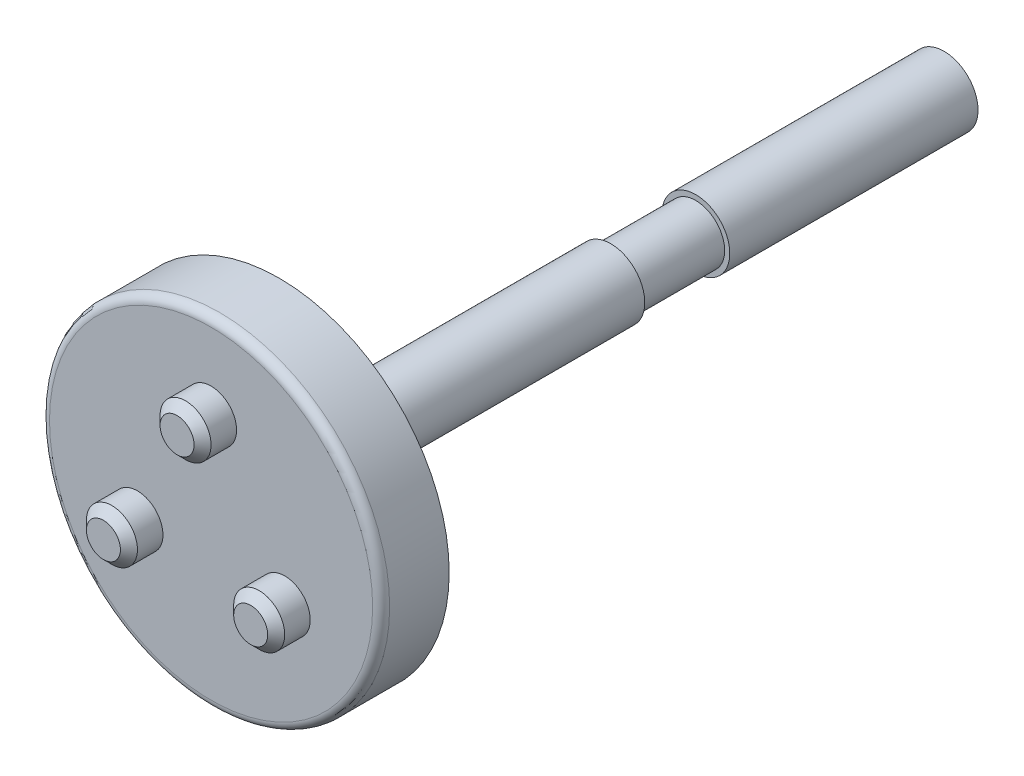
ISO-10303-21;
HEADER;
FILE_DESCRIPTION(('STEP AP214'),'2;1');
FILE_NAME('part.step','',(''),(''),'','','');
FILE_SCHEMA(('AUTOMOTIVE_DESIGN { 1 0 10303 214 1 1 1 1 }'));
ENDSEC;
DATA;
#1=APPLICATION_CONTEXT('core data for automotive mechanical design processes');
#2=APPLICATION_PROTOCOL_DEFINITION('international standard','automotive_design',2000,#1);
#3=PRODUCT_CONTEXT('',#1,'mechanical');
#4=PRODUCT('Part','Part','',(#3));
#5=PRODUCT_RELATED_PRODUCT_CATEGORY('part','',(#4));
#6=PRODUCT_DEFINITION_FORMATION('','',#4);
#7=PRODUCT_DEFINITION_CONTEXT('part definition',#1,'design');
#8=PRODUCT_DEFINITION('design','',#6,#7);
#9=PRODUCT_DEFINITION_SHAPE('','',#8);
#10=(LENGTH_UNIT() NAMED_UNIT(*) SI_UNIT(.MILLI.,.METRE.));
#11=(NAMED_UNIT(*) PLANE_ANGLE_UNIT() SI_UNIT($,.RADIAN.));
#12=(NAMED_UNIT(*) SI_UNIT($,.STERADIAN.) SOLID_ANGLE_UNIT());
#13=UNCERTAINTY_MEASURE_WITH_UNIT(LENGTH_MEASURE(1.E-05),#10,'distance_accuracy_value','');
#14=(GEOMETRIC_REPRESENTATION_CONTEXT(3) GLOBAL_UNCERTAINTY_ASSIGNED_CONTEXT((#13)) GLOBAL_UNIT_ASSIGNED_CONTEXT((#10,
#11,#12)) REPRESENTATION_CONTEXT('',''));
#15=CARTESIAN_POINT('',(0.,0.,0.));
#16=DIRECTION('',(0.,0.,1.));
#17=DIRECTION('',(1.,0.,0.));
#18=AXIS2_PLACEMENT_3D('',#15,#16,#17);
#19=CARTESIAN_POINT('',(0.,0.,-495.));
#20=DIRECTION('',(0.,0.,1.));
#21=DIRECTION('',(1.,0.,0.));
#22=AXIS2_PLACEMENT_3D('',#19,#20,#21);
#23=CYLINDRICAL_SURFACE('',#22,20.);
#24=CARTESIAN_POINT('',(0.,0.,-245.));
#25=DIRECTION('',(0.,0.,-1.));
#26=DIRECTION('',(-1.,0.,0.));
#27=AXIS2_PLACEMENT_3D('',#24,#25,#26);
#28=CIRCLE('',#27,20.);
#29=CARTESIAN_POINT('',(-20.,0.,-245.));
#30=VERTEX_POINT('',#29);
#31=EDGE_CURVE('E72',#30,#30,#28,.T.);
#32=ORIENTED_EDGE('',*,*,#31,.T.);
#33=EDGE_LOOP('',(#32));
#34=FACE_BOUND('',#33,.T.);
#35=CARTESIAN_POINT('',(0.,0.,-390.98));
#36=DIRECTION('',(0.,0.,-1.));
#37=DIRECTION('',(-1.,0.,0.));
#38=AXIS2_PLACEMENT_3D('',#35,#36,#37);
#39=CIRCLE('',#38,20.);
#40=CARTESIAN_POINT('',(-20.,0.,-390.98));
#41=VERTEX_POINT('',#40);
#42=EDGE_CURVE('E92',#41,#41,#39,.T.);
#43=ORIENTED_EDGE('',*,*,#42,.F.);
#44=EDGE_LOOP('',(#43));
#45=FACE_BOUND('',#44,.T.);
#46=ADVANCED_FACE('F35',(#34,#45),#23,.T.);
#47=CARTESIAN_POINT('',(0.,0.,0.));
#48=DIRECTION('',(0.,0.,-1.));
#49=DIRECTION('',(-1.,0.,0.));
#50=AXIS2_PLACEMENT_3D('',#47,#48,#49);
#51=CIRCLE('',#50,20.);
#52=CARTESIAN_POINT('',(-20.,0.,0.));
#53=VERTEX_POINT('',#52);
#54=EDGE_CURVE('E67',#53,#53,#51,.T.);
#55=ORIENTED_EDGE('',*,*,#54,.T.);
#56=EDGE_LOOP('',(#55));
#57=FACE_BOUND('',#56,.T.);
#58=CARTESIAN_POINT('',(0.,0.,-195.));
#59=DIRECTION('',(0.,0.,-1.));
#60=DIRECTION('',(-1.,0.,0.));
#61=AXIS2_PLACEMENT_3D('',#58,#59,#60);
#62=CIRCLE('',#61,20.);
#63=CARTESIAN_POINT('',(-20.,0.,-195.));
#64=VERTEX_POINT('',#63);
#65=EDGE_CURVE('E68',#64,#64,#62,.T.);
#66=ORIENTED_EDGE('',*,*,#65,.F.);
#67=EDGE_LOOP('',(#66));
#68=FACE_BOUND('',#67,.T.);
#69=ADVANCED_FACE('F101',(#57,#68),#23,.T.);
#70=CARTESIAN_POINT('',(0.,0.,40.));
#71=DIRECTION('',(0.,0.,-1.));
#72=DIRECTION('',(-1.,0.,0.));
#73=AXIS2_PLACEMENT_3D('',#70,#71,#72);
#74=CYLINDRICAL_SURFACE('',#73,100.);
#75=CARTESIAN_POINT('',(0.,0.,35.));
#76=DIRECTION('',(0.,0.,1.));
#77=DIRECTION('',(1.,0.,0.));
#78=AXIS2_PLACEMENT_3D('',#75,#76,#77);
#79=CIRCLE('',#78,100.);
#80=CARTESIAN_POINT('',(100.,0.,35.));
#81=VERTEX_POINT('',#80);
#82=EDGE_CURVE('E11',#81,#81,#79,.F.);
#83=ORIENTED_EDGE('',*,*,#82,.T.);
#84=EDGE_LOOP('',(#83));
#85=FACE_BOUND('',#84,.T.);
#86=CARTESIAN_POINT('',(0.,0.,0.));
#87=DIRECTION('',(0.,0.,1.));
#88=DIRECTION('',(1.,0.,0.));
#89=AXIS2_PLACEMENT_3D('',#86,#87,#88);
#90=CIRCLE('',#89,100.);
#91=CARTESIAN_POINT('',(100.,0.,0.));
#92=VERTEX_POINT('',#91);
#93=EDGE_CURVE('E76',#92,#92,#90,.T.);
#94=ORIENTED_EDGE('',*,*,#93,.T.);
#95=EDGE_LOOP('',(#94));
#96=FACE_BOUND('',#95,.T.);
#97=ADVANCED_FACE('F109',(#85,#96),#74,.T.);
#98=CARTESIAN_POINT('',(0.,0.,40.));
#99=DIRECTION('',(0.,0.,1.));
#100=DIRECTION('',(1.,0.,0.));
#101=AXIS2_PLACEMENT_3D('',#98,#99,#100);
#102=PLANE('',#101);
#103=CARTESIAN_POINT('',(0.,0.,40.));
#104=DIRECTION('',(0.,0.,1.));
#105=DIRECTION('',(1.,0.,0.));
#106=AXIS2_PLACEMENT_3D('',#103,#104,#105);
#107=CIRCLE('',#106,95.);
#108=CARTESIAN_POINT('',(95.,0.,40.));
#109=VERTEX_POINT('',#108);
#110=EDGE_CURVE('E42',#109,#109,#107,.T.);
#111=ORIENTED_EDGE('',*,*,#110,.T.);
#112=EDGE_LOOP('',(#111));
#113=FACE_BOUND('',#112,.T.);
#114=CARTESIAN_POINT('',(-43.3012701892219,-25.,40.));
#115=DIRECTION('',(0.,0.,1.));
#116=DIRECTION('',(1.,0.,0.));
#117=AXIS2_PLACEMENT_3D('',#114,#115,#116);
#118=CIRCLE('',#117,15.0000000000005);
#119=CARTESIAN_POINT('',(-28.3012701892215,-25.,40.));
#120=VERTEX_POINT('',#119);
#121=EDGE_CURVE('E71',#120,#120,#118,.T.);
#122=ORIENTED_EDGE('',*,*,#121,.F.);
#123=EDGE_LOOP('',(#122));
#124=FACE_BOUND('',#123,.T.);
#125=CARTESIAN_POINT('',(43.3012701892219,-25.,40.));
#126=DIRECTION('',(0.,0.,1.));
#127=DIRECTION('',(1.,0.,0.));
#128=AXIS2_PLACEMENT_3D('',#125,#126,#127);
#129=CIRCLE('',#128,15.0000000000002);
#130=CARTESIAN_POINT('',(58.3012701892221,-25.,40.));
#131=VERTEX_POINT('',#130);
#132=EDGE_CURVE('E82',#131,#131,#129,.T.);
#133=ORIENTED_EDGE('',*,*,#132,.F.);
#134=EDGE_LOOP('',(#133));
#135=FACE_BOUND('',#134,.T.);
#136=CARTESIAN_POINT('',(0.,50.,40.));
#137=DIRECTION('',(0.,0.,1.));
#138=DIRECTION('',(1.,0.,0.));
#139=AXIS2_PLACEMENT_3D('',#136,#137,#138);
#140=CIRCLE('',#139,15.);
#141=CARTESIAN_POINT('',(15.,50.,40.));
#142=VERTEX_POINT('',#141);
#143=EDGE_CURVE('E79',#142,#142,#140,.T.);
#144=ORIENTED_EDGE('',*,*,#143,.F.);
#145=EDGE_LOOP('',(#144));
#146=FACE_BOUND('',#145,.T.);
#147=ADVANCED_FACE('F141',(#113,#124,#135,#146),#102,.T.);
#148=CARTESIAN_POINT('',(0.,0.,0.));
#149=DIRECTION('',(0.,0.,1.));
#150=DIRECTION('',(1.,0.,0.));
#151=AXIS2_PLACEMENT_3D('',#148,#149,#150);
#152=PLANE('',#151);
#153=ORIENTED_EDGE('',*,*,#54,.F.);
#154=EDGE_LOOP('',(#153));
#155=FACE_BOUND('',#154,.T.);
#156=ORIENTED_EDGE('',*,*,#93,.F.);
#157=EDGE_LOOP('',(#156));
#158=FACE_BOUND('',#157,.T.);
#159=ADVANCED_FACE('F139',(#155,#158),#152,.F.);
#160=CARTESIAN_POINT('',(0.,50.,60.));
#161=DIRECTION('',(0.,0.,-1.));
#162=DIRECTION('',(-1.,0.,0.));
#163=AXIS2_PLACEMENT_3D('',#160,#161,#162);
#164=CYLINDRICAL_SURFACE('',#163,15.);
#165=CARTESIAN_POINT('',(0.,50.,55.));
#166=DIRECTION('',(0.,0.,1.));
#167=DIRECTION('',(1.,0.,0.));
#168=AXIS2_PLACEMENT_3D('',#165,#166,#167);
#169=CIRCLE('',#168,15.);
#170=CARTESIAN_POINT('',(15.,50.,55.));
#171=VERTEX_POINT('',#170);
#172=EDGE_CURVE('E46',#171,#171,#169,.F.);
#173=ORIENTED_EDGE('',*,*,#172,.T.);
#174=EDGE_LOOP('',(#173));
#175=FACE_BOUND('',#174,.T.);
#176=ORIENTED_EDGE('',*,*,#143,.T.);
#177=EDGE_LOOP('',(#176));
#178=FACE_BOUND('',#177,.T.);
#179=ADVANCED_FACE('F135',(#175,#178),#164,.T.);
#180=CARTESIAN_POINT('',(0.,50.,60.));
#181=DIRECTION('',(0.,0.,1.));
#182=DIRECTION('',(1.,0.,0.));
#183=AXIS2_PLACEMENT_3D('',#180,#181,#182);
#184=PLANE('',#183);
#185=CARTESIAN_POINT('',(0.,50.,60.));
#186=DIRECTION('',(0.,0.,1.));
#187=DIRECTION('',(1.,0.,0.));
#188=AXIS2_PLACEMENT_3D('',#185,#186,#187);
#189=CIRCLE('',#188,10.0000000000001);
#190=CARTESIAN_POINT('',(10.0000000000001,50.,60.));
#191=VERTEX_POINT('',#190);
#192=EDGE_CURVE('E50',#191,#191,#189,.T.);
#193=ORIENTED_EDGE('',*,*,#192,.T.);
#194=EDGE_LOOP('',(#193));
#195=FACE_BOUND('',#194,.T.);
#196=ADVANCED_FACE('F131',(#195),#184,.T.);
#197=CARTESIAN_POINT('',(43.3012701892219,-25.,60.));
#198=DIRECTION('',(0.,0.,-1.));
#199=DIRECTION('',(-1.,0.,0.));
#200=AXIS2_PLACEMENT_3D('',#197,#198,#199);
#201=CYLINDRICAL_SURFACE('',#200,15.0000000000002);
#202=CARTESIAN_POINT('',(43.3012701892219,-25.,55.));
#203=DIRECTION('',(0.,0.,1.));
#204=DIRECTION('',(1.,0.,0.));
#205=AXIS2_PLACEMENT_3D('',#202,#203,#204);
#206=CIRCLE('',#205,15.0000000000002);
#207=CARTESIAN_POINT('',(58.3012701892221,-25.,55.));
#208=VERTEX_POINT('',#207);
#209=EDGE_CURVE('E55',#208,#208,#206,.F.);
#210=ORIENTED_EDGE('',*,*,#209,.T.);
#211=EDGE_LOOP('',(#210));
#212=FACE_BOUND('',#211,.T.);
#213=ORIENTED_EDGE('',*,*,#132,.T.);
#214=EDGE_LOOP('',(#213));
#215=FACE_BOUND('',#214,.T.);
#216=ADVANCED_FACE('F127',(#212,#215),#201,.T.);
#217=CARTESIAN_POINT('',(43.3012701892219,-25.,60.));
#218=DIRECTION('',(0.,0.,1.));
#219=DIRECTION('',(1.,0.,0.));
#220=AXIS2_PLACEMENT_3D('',#217,#218,#219);
#221=PLANE('',#220);
#222=CARTESIAN_POINT('',(43.3012701892219,-25.,60.));
#223=DIRECTION('',(0.,0.,1.));
#224=DIRECTION('',(1.,0.,0.));
#225=AXIS2_PLACEMENT_3D('',#222,#223,#224);
#226=CIRCLE('',#225,10.0000000000002);
#227=CARTESIAN_POINT('',(53.3012701892221,-25.,60.));
#228=VERTEX_POINT('',#227);
#229=EDGE_CURVE('E58',#228,#228,#226,.T.);
#230=ORIENTED_EDGE('',*,*,#229,.T.);
#231=EDGE_LOOP('',(#230));
#232=FACE_BOUND('',#231,.T.);
#233=ADVANCED_FACE('F123',(#232),#221,.T.);
#234=CARTESIAN_POINT('',(-43.3012701892219,-25.,60.));
#235=DIRECTION('',(0.,0.,-1.));
#236=DIRECTION('',(-1.,0.,0.));
#237=AXIS2_PLACEMENT_3D('',#234,#235,#236);
#238=CYLINDRICAL_SURFACE('',#237,15.0000000000005);
#239=CARTESIAN_POINT('',(-43.3012701892219,-25.,54.9999999999999));
#240=DIRECTION('',(0.,0.,1.));
#241=DIRECTION('',(1.,0.,0.));
#242=AXIS2_PLACEMENT_3D('',#239,#240,#241);
#243=CIRCLE('',#242,15.0000000000005);
#244=CARTESIAN_POINT('',(-28.3012701892215,-25.,54.9999999999999));
#245=VERTEX_POINT('',#244);
#246=EDGE_CURVE('E61',#245,#245,#243,.F.);
#247=ORIENTED_EDGE('',*,*,#246,.T.);
#248=EDGE_LOOP('',(#247));
#249=FACE_BOUND('',#248,.T.);
#250=ORIENTED_EDGE('',*,*,#121,.T.);
#251=EDGE_LOOP('',(#250));
#252=FACE_BOUND('',#251,.T.);
#253=ADVANCED_FACE('F119',(#249,#252),#238,.T.);
#254=CARTESIAN_POINT('',(-43.3012701892219,-25.,60.));
#255=DIRECTION('',(0.,0.,1.));
#256=DIRECTION('',(1.,0.,0.));
#257=AXIS2_PLACEMENT_3D('',#254,#255,#256);
#258=PLANE('',#257);
#259=CARTESIAN_POINT('',(-43.3012701892219,-25.,60.));
#260=DIRECTION('',(0.,0.,1.));
#261=DIRECTION('',(1.,0.,0.));
#262=AXIS2_PLACEMENT_3D('',#259,#260,#261);
#263=CIRCLE('',#262,10.0000000000004);
#264=CARTESIAN_POINT('',(-33.3012701892215,-25.,60.));
#265=VERTEX_POINT('',#264);
#266=EDGE_CURVE('E64',#265,#265,#263,.T.);
#267=ORIENTED_EDGE('',*,*,#266,.T.);
#268=EDGE_LOOP('',(#267));
#269=FACE_BOUND('',#268,.T.);
#270=ADVANCED_FACE('F115',(#269),#258,.T.);
#271=CARTESIAN_POINT('',(0.,0.,-195.));
#272=DIRECTION('',(0.,0.,-1.));
#273=DIRECTION('',(-1.,0.,0.));
#274=AXIS2_PLACEMENT_3D('',#271,#272,#273);
#275=PLANE('',#274);
#276=CARTESIAN_POINT('',(0.,0.,-195.));
#277=DIRECTION('',(0.,0.,-1.));
#278=DIRECTION('',(-1.,0.,0.));
#279=AXIS2_PLACEMENT_3D('',#276,#277,#278);
#280=CIRCLE('',#279,17.);
#281=CARTESIAN_POINT('',(-17.,0.,-195.));
#282=VERTEX_POINT('',#281);
#283=EDGE_CURVE('E75',#282,#282,#280,.T.);
#284=ORIENTED_EDGE('',*,*,#283,.F.);
#285=EDGE_LOOP('',(#284));
#286=FACE_BOUND('',#285,.T.);
#287=ORIENTED_EDGE('',*,*,#65,.T.);
#288=EDGE_LOOP('',(#287));
#289=FACE_BOUND('',#288,.T.);
#290=ADVANCED_FACE('F118',(#286,#289),#275,.T.);
#291=CARTESIAN_POINT('',(0.,0.,-245.));
#292=DIRECTION('',(0.,0.,-1.));
#293=DIRECTION('',(-1.,0.,0.));
#294=AXIS2_PLACEMENT_3D('',#291,#292,#293);
#295=PLANE('',#294);
#296=CARTESIAN_POINT('',(0.,0.,-245.));
#297=DIRECTION('',(0.,0.,-1.));
#298=DIRECTION('',(-1.,0.,0.));
#299=AXIS2_PLACEMENT_3D('',#296,#297,#298);
#300=CIRCLE('',#299,17.);
#301=CARTESIAN_POINT('',(-17.,0.,-245.));
#302=VERTEX_POINT('',#301);
#303=EDGE_CURVE('E89',#302,#302,#300,.T.);
#304=ORIENTED_EDGE('',*,*,#303,.T.);
#305=EDGE_LOOP('',(#304));
#306=FACE_BOUND('',#305,.T.);
#307=ORIENTED_EDGE('',*,*,#31,.F.);
#308=EDGE_LOOP('',(#307));
#309=FACE_BOUND('',#308,.T.);
#310=ADVANCED_FACE('F113',(#306,#309),#295,.F.);
#311=CARTESIAN_POINT('',(0.,0.,-195.));
#312=DIRECTION('',(0.,0.,-1.));
#313=DIRECTION('',(-1.,0.,0.));
#314=AXIS2_PLACEMENT_3D('',#311,#312,#313);
#315=CYLINDRICAL_SURFACE('',#314,17.);
#316=ORIENTED_EDGE('',*,*,#283,.T.);
#317=EDGE_LOOP('',(#316));
#318=FACE_BOUND('',#317,.T.);
#319=ORIENTED_EDGE('',*,*,#303,.F.);
#320=EDGE_LOOP('',(#319));
#321=FACE_BOUND('',#320,.T.);
#322=ADVANCED_FACE('F153',(#318,#321),#315,.T.);
#323=CARTESIAN_POINT('',(-43.3012701892219,-25.,60.));
#324=DIRECTION('',(0.,0.,-1.));
#325=DIRECTION('',(-1.,0.,0.));
#326=AXIS2_PLACEMENT_3D('',#323,#324,#325);
#327=CONICAL_SURFACE('',#326,10.0000000000004,0.785398163397446);
#328=ORIENTED_EDGE('',*,*,#246,.F.);
#329=EDGE_LOOP('',(#328));
#330=FACE_BOUND('',#329,.T.);
#331=ORIENTED_EDGE('',*,*,#266,.F.);
#332=EDGE_LOOP('',(#331));
#333=FACE_BOUND('',#332,.T.);
#334=ADVANCED_FACE('F149',(#330,#333),#327,.T.);
#335=CARTESIAN_POINT('',(43.3012701892219,-25.,60.));
#336=DIRECTION('',(0.,0.,-1.));
#337=DIRECTION('',(-1.,0.,0.));
#338=AXIS2_PLACEMENT_3D('',#335,#336,#337);
#339=CONICAL_SURFACE('',#338,10.0000000000002,0.785398163397449);
#340=ORIENTED_EDGE('',*,*,#209,.F.);
#341=EDGE_LOOP('',(#340));
#342=FACE_BOUND('',#341,.T.);
#343=ORIENTED_EDGE('',*,*,#229,.F.);
#344=EDGE_LOOP('',(#343));
#345=FACE_BOUND('',#344,.T.);
#346=ADVANCED_FACE('F152',(#342,#345),#339,.T.);
#347=CARTESIAN_POINT('',(0.,50.,60.));
#348=DIRECTION('',(0.,0.,-1.));
#349=DIRECTION('',(-1.,0.,0.));
#350=AXIS2_PLACEMENT_3D('',#347,#348,#349);
#351=CONICAL_SURFACE('',#350,10.0000000000001,0.785398163397443);
#352=ORIENTED_EDGE('',*,*,#172,.F.);
#353=EDGE_LOOP('',(#352));
#354=FACE_BOUND('',#353,.T.);
#355=ORIENTED_EDGE('',*,*,#192,.F.);
#356=EDGE_LOOP('',(#355));
#357=FACE_BOUND('',#356,.T.);
#358=ADVANCED_FACE('F156',(#354,#357),#351,.T.);
#359=CARTESIAN_POINT('',(0.,0.,35.));
#360=DIRECTION('',(0.,0.,1.));
#361=DIRECTION('',(1.,0.,0.));
#362=AXIS2_PLACEMENT_3D('',#359,#360,#361);
#363=TOROIDAL_SURFACE('',#362,95.,5.);
#364=ORIENTED_EDGE('',*,*,#82,.F.);
#365=EDGE_LOOP('',(#364));
#366=FACE_BOUND('',#365,.T.);
#367=ORIENTED_EDGE('',*,*,#110,.F.);
#368=EDGE_LOOP('',(#367));
#369=FACE_BOUND('',#368,.T.);
#370=ADVANCED_FACE('F37',(#366,#369),#363,.T.);
#371=CARTESIAN_POINT('',(0.,0.,-390.98));
#372=DIRECTION('',(0.,0.,-1.));
#373=DIRECTION('',(-1.,0.,0.));
#374=AXIS2_PLACEMENT_3D('',#371,#372,#373);
#375=PLANE('',#374);
#376=ORIENTED_EDGE('',*,*,#42,.T.);
#377=EDGE_LOOP('',(#376));
#378=FACE_BOUND('',#377,.T.);
#379=ADVANCED_FACE('F98',(#378),#375,.T.);
#380=CLOSED_SHELL('',(#46,#69,#97,#147,#159,#179,#196,#216,#233,#253,#270,#290,#310,#322,#334,
#346,#358,#370,#379));
#381=MANIFOLD_SOLID_BREP('B2',#380);
#382=ADVANCED_BREP_SHAPE_REPRESENTATION('',(#18,#381),#14);
#383=SHAPE_DEFINITION_REPRESENTATION(#9,#382);
ENDSEC;
END-ISO-10303-21;
